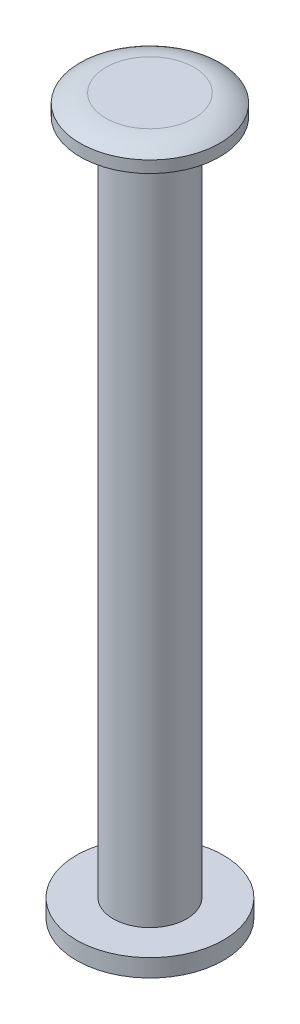
ISO-10303-21;
HEADER;
FILE_DESCRIPTION(('STEP AP214'),'2;1');
FILE_NAME('part.step','',(''),(''),'','','');
FILE_SCHEMA(('AUTOMOTIVE_DESIGN { 1 0 10303 214 1 1 1 1 }'));
ENDSEC;
DATA;
#1=APPLICATION_CONTEXT('core data for automotive mechanical design processes');
#2=APPLICATION_PROTOCOL_DEFINITION('international standard','automotive_design',2000,#1);
#3=PRODUCT_CONTEXT('',#1,'mechanical');
#4=PRODUCT('Part','Part','',(#3));
#5=PRODUCT_RELATED_PRODUCT_CATEGORY('part','',(#4));
#6=PRODUCT_DEFINITION_FORMATION('','',#4);
#7=PRODUCT_DEFINITION_CONTEXT('part definition',#1,'design');
#8=PRODUCT_DEFINITION('design','',#6,#7);
#9=PRODUCT_DEFINITION_SHAPE('','',#8);
#10=(LENGTH_UNIT() NAMED_UNIT(*) SI_UNIT(.MILLI.,.METRE.));
#11=(NAMED_UNIT(*) PLANE_ANGLE_UNIT() SI_UNIT($,.RADIAN.));
#12=(NAMED_UNIT(*) SI_UNIT($,.STERADIAN.) SOLID_ANGLE_UNIT());
#13=UNCERTAINTY_MEASURE_WITH_UNIT(LENGTH_MEASURE(1.E-05),#10,'distance_accuracy_value','');
#14=(GEOMETRIC_REPRESENTATION_CONTEXT(3) GLOBAL_UNCERTAINTY_ASSIGNED_CONTEXT((#13)) GLOBAL_UNIT_ASSIGNED_CONTEXT((#10,
#11,#12)) REPRESENTATION_CONTEXT('',''));
#15=CARTESIAN_POINT('',(0.,0.,0.));
#16=DIRECTION('',(0.,0.,1.));
#17=DIRECTION('',(1.,0.,0.));
#18=AXIS2_PLACEMENT_3D('',#15,#16,#17);
#19=CARTESIAN_POINT('',(0.,49.3,0.));
#20=DIRECTION('',(0.,-1.,0.));
#21=DIRECTION('',(0.,0.,-1.));
#22=AXIS2_PLACEMENT_3D('',#19,#20,#21);
#23=PLANE('',#22);
#24=CARTESIAN_POINT('',(0.,49.3,0.));
#25=DIRECTION('',(0.,-1.,0.));
#26=DIRECTION('',(0.,0.,-1.));
#27=AXIS2_PLACEMENT_3D('',#24,#25,#26);
#28=CIRCLE('',#27,3.);
#29=CARTESIAN_POINT('',(0.,49.3,-3.));
#30=VERTEX_POINT('',#29);
#31=EDGE_CURVE('E11',#30,#30,#28,.T.);
#32=ORIENTED_EDGE('',*,*,#31,.F.);
#33=EDGE_LOOP('',(#32));
#34=FACE_BOUND('',#33,.T.);
#35=ADVANCED_FACE('F43',(#34),#23,.F.);
#36=CARTESIAN_POINT('',(0.,46.4479166666667,0.));
#37=DIRECTION('',(0.,-1.,0.));
#38=DIRECTION('',(0.,0.,-1.));
#39=AXIS2_PLACEMENT_3D('',#36,#37,#38);
#40=TOROIDAL_SURFACE('',#39,3.,2.85208333333334);
#41=CARTESIAN_POINT('',(0.,48.7,0.));
#42=DIRECTION('',(0.,-1.,0.));
#43=DIRECTION('',(0.,0.,-1.));
#44=AXIS2_PLACEMENT_3D('',#41,#42,#43);
#45=CIRCLE('',#44,4.75);
#46=CARTESIAN_POINT('',(0.,48.7,-4.75));
#47=VERTEX_POINT('',#46);
#48=EDGE_CURVE('E49',#47,#47,#45,.T.);
#49=ORIENTED_EDGE('',*,*,#48,.F.);
#50=EDGE_LOOP('',(#49));
#51=FACE_BOUND('',#50,.T.);
#52=ORIENTED_EDGE('',*,*,#31,.T.);
#53=EDGE_LOOP('',(#52));
#54=FACE_BOUND('',#53,.T.);
#55=ADVANCED_FACE('F82',(#51,#54),#40,.T.);
#56=CARTESIAN_POINT('',(0.,-6.25621089982076,0.));
#57=DIRECTION('',(0.,-1.,0.));
#58=DIRECTION('',(0.,0.,-1.));
#59=AXIS2_PLACEMENT_3D('',#56,#57,#58);
#60=CYLINDRICAL_SURFACE('',#59,4.75);
#61=CARTESIAN_POINT('',(0.,47.9,0.));
#62=DIRECTION('',(0.,-1.,0.));
#63=DIRECTION('',(0.,0.,-1.));
#64=AXIS2_PLACEMENT_3D('',#61,#62,#63);
#65=CIRCLE('',#64,4.75);
#66=CARTESIAN_POINT('',(0.,47.9,-4.75));
#67=VERTEX_POINT('',#66);
#68=EDGE_CURVE('E53',#67,#67,#65,.T.);
#69=ORIENTED_EDGE('',*,*,#68,.F.);
#70=EDGE_LOOP('',(#69));
#71=FACE_BOUND('',#70,.T.);
#72=ORIENTED_EDGE('',*,*,#48,.T.);
#73=EDGE_LOOP('',(#72));
#74=FACE_BOUND('',#73,.T.);
#75=ADVANCED_FACE('F77',(#71,#74),#60,.T.);
#76=CARTESIAN_POINT('',(0.,47.9,0.));
#77=DIRECTION('',(0.,1.,0.));
#78=DIRECTION('',(0.,0.,1.));
#79=AXIS2_PLACEMENT_3D('',#76,#77,#78);
#80=PLANE('',#79);
#81=CARTESIAN_POINT('',(0.,47.9,0.));
#82=DIRECTION('',(0.,-1.,0.));
#83=DIRECTION('',(0.,0.,-1.));
#84=AXIS2_PLACEMENT_3D('',#81,#82,#83);
#85=CIRCLE('',#84,1.95);
#86=CARTESIAN_POINT('',(0.,47.9,-1.95));
#87=VERTEX_POINT('',#86);
#88=EDGE_CURVE('E57',#87,#87,#85,.T.);
#89=ORIENTED_EDGE('',*,*,#88,.F.);
#90=EDGE_LOOP('',(#89));
#91=FACE_BOUND('',#90,.T.);
#92=ORIENTED_EDGE('',*,*,#68,.T.);
#93=EDGE_LOOP('',(#92));
#94=FACE_BOUND('',#93,.T.);
#95=ADVANCED_FACE('F71',(#91,#94),#80,.F.);
#96=CARTESIAN_POINT('',(0.,-6.25621089982076,0.));
#97=DIRECTION('',(0.,-1.,0.));
#98=DIRECTION('',(0.,0.,-1.));
#99=AXIS2_PLACEMENT_3D('',#96,#97,#98);
#100=CYLINDRICAL_SURFACE('',#99,1.95);
#101=CARTESIAN_POINT('',(0.,43.9,0.));
#102=DIRECTION('',(0.,-1.,0.));
#103=DIRECTION('',(0.,0.,-1.));
#104=AXIS2_PLACEMENT_3D('',#101,#102,#103);
#105=CIRCLE('',#104,1.95);
#106=CARTESIAN_POINT('',(0.,43.9,-1.95));
#107=VERTEX_POINT('',#106);
#108=EDGE_CURVE('E62',#107,#107,#105,.T.);
#109=ORIENTED_EDGE('',*,*,#108,.F.);
#110=EDGE_LOOP('',(#109));
#111=FACE_BOUND('',#110,.T.);
#112=ORIENTED_EDGE('',*,*,#88,.T.);
#113=EDGE_LOOP('',(#112));
#114=FACE_BOUND('',#113,.T.);
#115=ADVANCED_FACE('F68',(#111,#114),#100,.T.);
#116=CARTESIAN_POINT('',(0.,43.9,0.));
#117=DIRECTION('',(0.,1.,0.));
#118=DIRECTION('',(0.,0.,1.));
#119=AXIS2_PLACEMENT_3D('',#116,#117,#118);
#120=PLANE('',#119);
#121=ORIENTED_EDGE('',*,*,#108,.T.);
#122=EDGE_LOOP('',(#121));
#123=FACE_BOUND('',#122,.T.);
#124=ADVANCED_FACE('F66',(#123),#120,.F.);
#125=CLOSED_SHELL('',(#35,#55,#75,#95,#115,#124));
#126=MANIFOLD_SOLID_BREP('B2',#125);
#127=CARTESIAN_POINT('',(0.,3.20714285714286,0.));
#128=DIRECTION('',(0.,1.,0.));
#129=DIRECTION('',(0.,0.,1.));
#130=AXIS2_PLACEMENT_3D('',#127,#128,#129);
#131=DEGENERATE_TOROIDAL_SURFACE('',#130,3.,3.20714285714286,.T.);
#132=CARTESIAN_POINT('',(0.,0.,0.));
#133=DIRECTION('',(0.,1.,0.));
#134=DIRECTION('',(0.,0.,1.));
#135=AXIS2_PLACEMENT_3D('',#132,#133,#134);
#136=CIRCLE('',#135,3.);
#137=CARTESIAN_POINT('',(0.,0.,3.));
#138=VERTEX_POINT('',#137);
#139=EDGE_CURVE('E154',#138,#138,#136,.T.);
#140=ORIENTED_EDGE('',*,*,#139,.T.);
#141=EDGE_LOOP('',(#140));
#142=FACE_BOUND('',#141,.T.);
#143=CARTESIAN_POINT('',(0.,0.699999999999999,0.));
#144=DIRECTION('',(0.,1.,0.));
#145=DIRECTION('',(0.,0.,1.));
#146=AXIS2_PLACEMENT_3D('',#143,#144,#145);
#147=CIRCLE('',#146,5.);
#148=CARTESIAN_POINT('',(0.,0.699999999999999,5.));
#149=VERTEX_POINT('',#148);
#150=EDGE_CURVE('E42',#149,#149,#147,.T.);
#151=ORIENTED_EDGE('',*,*,#150,.F.);
#152=EDGE_LOOP('',(#151));
#153=FACE_BOUND('',#152,.T.);
#154=ADVANCED_FACE('F129',(#142,#153),#131,.T.);
#155=CARTESIAN_POINT('',(0.,8.46991973099299,0.));
#156=DIRECTION('',(0.,1.,0.));
#157=DIRECTION('',(0.,0.,1.));
#158=AXIS2_PLACEMENT_3D('',#155,#156,#157);
#159=CYLINDRICAL_SURFACE('',#158,5.);
#160=CARTESIAN_POINT('',(0.,1.9,0.));
#161=DIRECTION('',(0.,1.,0.));
#162=DIRECTION('',(0.,0.,1.));
#163=AXIS2_PLACEMENT_3D('',#160,#161,#162);
#164=CIRCLE('',#163,5.);
#165=CARTESIAN_POINT('',(0.,1.9,5.));
#166=VERTEX_POINT('',#165);
#167=EDGE_CURVE('E135',#166,#166,#164,.T.);
#168=ORIENTED_EDGE('',*,*,#167,.F.);
#169=EDGE_LOOP('',(#168));
#170=FACE_BOUND('',#169,.T.);
#171=ORIENTED_EDGE('',*,*,#150,.T.);
#172=EDGE_LOOP('',(#171));
#173=FACE_BOUND('',#172,.T.);
#174=ADVANCED_FACE('F171',(#170,#173),#159,.T.);
#175=CARTESIAN_POINT('',(0.,1.9,0.));
#176=DIRECTION('',(0.,-1.,0.));
#177=DIRECTION('',(0.,0.,-1.));
#178=AXIS2_PLACEMENT_3D('',#175,#176,#177);
#179=PLANE('',#178);
#180=CARTESIAN_POINT('',(0.,1.9,0.));
#181=DIRECTION('',(0.,1.,0.));
#182=DIRECTION('',(0.,0.,1.));
#183=AXIS2_PLACEMENT_3D('',#180,#181,#182);
#184=CIRCLE('',#183,2.5);
#185=CARTESIAN_POINT('',(0.,1.9,2.5));
#186=VERTEX_POINT('',#185);
#187=EDGE_CURVE('E139',#186,#186,#184,.T.);
#188=ORIENTED_EDGE('',*,*,#187,.F.);
#189=EDGE_LOOP('',(#188));
#190=FACE_BOUND('',#189,.T.);
#191=ORIENTED_EDGE('',*,*,#167,.T.);
#192=EDGE_LOOP('',(#191));
#193=FACE_BOUND('',#192,.T.);
#194=ADVANCED_FACE('F175',(#190,#193),#179,.F.);
#195=CARTESIAN_POINT('',(0.,8.46991973099299,0.));
#196=DIRECTION('',(0.,1.,0.));
#197=DIRECTION('',(0.,0.,1.));
#198=AXIS2_PLACEMENT_3D('',#195,#196,#197);
#199=CYLINDRICAL_SURFACE('',#198,2.5);
#200=CARTESIAN_POINT('',(0.,46.9,0.));
#201=DIRECTION('',(0.,1.,0.));
#202=DIRECTION('',(0.,0.,1.));
#203=AXIS2_PLACEMENT_3D('',#200,#201,#202);
#204=CIRCLE('',#203,2.5);
#205=CARTESIAN_POINT('',(0.,46.9,2.5));
#206=VERTEX_POINT('',#205);
#207=EDGE_CURVE('E143',#206,#206,#204,.T.);
#208=ORIENTED_EDGE('',*,*,#207,.F.);
#209=EDGE_LOOP('',(#208));
#210=FACE_BOUND('',#209,.T.);
#211=ORIENTED_EDGE('',*,*,#187,.T.);
#212=EDGE_LOOP('',(#211));
#213=FACE_BOUND('',#212,.T.);
#214=ADVANCED_FACE('F180',(#210,#213),#199,.T.);
#215=CARTESIAN_POINT('',(0.,46.9,0.));
#216=DIRECTION('',(0.,-1.,0.));
#217=DIRECTION('',(0.,0.,-1.));
#218=AXIS2_PLACEMENT_3D('',#215,#216,#217);
#219=PLANE('',#218);
#220=CARTESIAN_POINT('',(0.,46.9,0.));
#221=DIRECTION('',(0.,1.,0.));
#222=DIRECTION('',(0.,0.,1.));
#223=AXIS2_PLACEMENT_3D('',#220,#221,#222);
#224=CIRCLE('',#223,1.99999999999999);
#225=CARTESIAN_POINT('',(0.,46.9,1.99999999999999));
#226=VERTEX_POINT('',#225);
#227=EDGE_CURVE('E148',#226,#226,#224,.T.);
#228=ORIENTED_EDGE('',*,*,#227,.F.);
#229=EDGE_LOOP('',(#228));
#230=FACE_BOUND('',#229,.T.);
#231=ORIENTED_EDGE('',*,*,#207,.T.);
#232=EDGE_LOOP('',(#231));
#233=FACE_BOUND('',#232,.T.);
#234=ADVANCED_FACE('F186',(#230,#233),#219,.F.);
#235=CARTESIAN_POINT('',(0.,8.46991973099299,0.));
#236=DIRECTION('',(0.,1.,0.));
#237=DIRECTION('',(0.,0.,1.));
#238=AXIS2_PLACEMENT_3D('',#235,#236,#237);
#239=CYLINDRICAL_SURFACE('',#238,2.);
#240=CARTESIAN_POINT('',(0.,1.9,0.));
#241=DIRECTION('',(0.,1.,0.));
#242=DIRECTION('',(0.,0.,1.));
#243=AXIS2_PLACEMENT_3D('',#240,#241,#242);
#244=CIRCLE('',#243,2.);
#245=CARTESIAN_POINT('',(0.,1.9,2.));
#246=VERTEX_POINT('',#245);
#247=EDGE_CURVE('E151',#246,#246,#244,.T.);
#248=ORIENTED_EDGE('',*,*,#247,.F.);
#249=EDGE_LOOP('',(#248));
#250=FACE_BOUND('',#249,.T.);
#251=ORIENTED_EDGE('',*,*,#227,.T.);
#252=EDGE_LOOP('',(#251));
#253=FACE_BOUND('',#252,.T.);
#254=ADVANCED_FACE('F167',(#250,#253),#239,.F.);
#255=CARTESIAN_POINT('',(0.,1.9,0.));
#256=DIRECTION('',(0.,-1.,0.));
#257=DIRECTION('',(0.,0.,-1.));
#258=AXIS2_PLACEMENT_3D('',#255,#256,#257);
#259=PLANE('',#258);
#260=ORIENTED_EDGE('',*,*,#247,.T.);
#261=EDGE_LOOP('',(#260));
#262=FACE_BOUND('',#261,.T.);
#263=ADVANCED_FACE('F162',(#262),#259,.F.);
#264=CARTESIAN_POINT('',(0.,0.,0.));
#265=DIRECTION('',(0.,1.,0.));
#266=DIRECTION('',(0.,0.,1.));
#267=AXIS2_PLACEMENT_3D('',#264,#265,#266);
#268=PLANE('',#267);
#269=ORIENTED_EDGE('',*,*,#139,.F.);
#270=EDGE_LOOP('',(#269));
#271=FACE_BOUND('',#270,.T.);
#272=ADVANCED_FACE('F160',(#271),#268,.F.);
#273=CLOSED_SHELL('',(#154,#174,#194,#214,#234,#254,#263,#272));
#274=MANIFOLD_SOLID_BREP('B6',#273);
#275=ADVANCED_BREP_SHAPE_REPRESENTATION('',(#18,#126,#274),#14);
#276=SHAPE_DEFINITION_REPRESENTATION(#9,#275);
ENDSEC;
END-ISO-10303-21;
